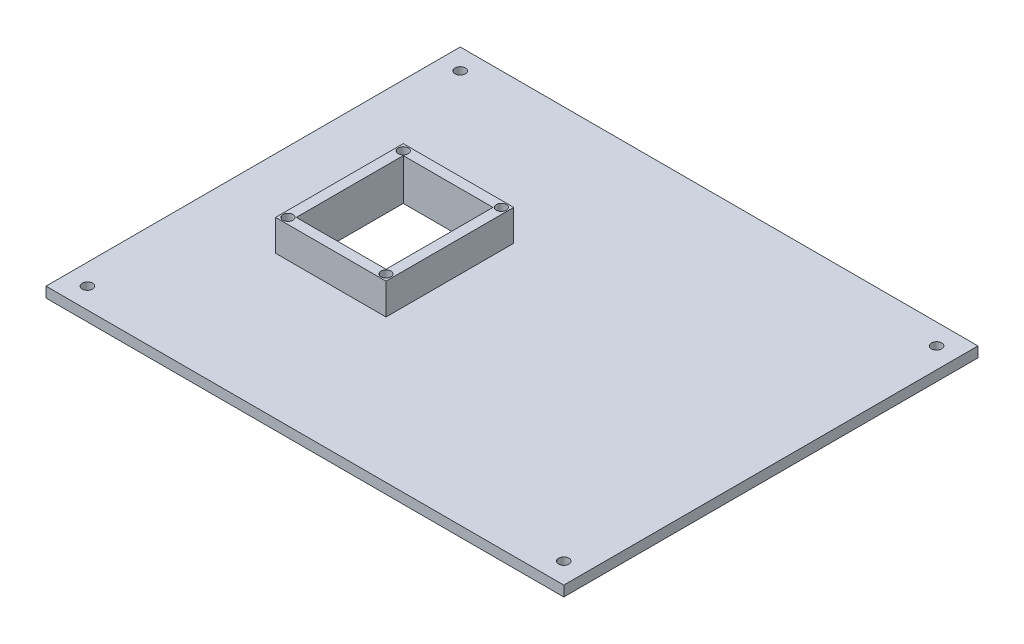
ISO-10303-21;
HEADER;
FILE_DESCRIPTION(('STEP AP214'),'2;1');
FILE_NAME('part.step','',(''),(''),'','','');
FILE_SCHEMA(('AUTOMOTIVE_DESIGN { 1 0 10303 214 1 1 1 1 }'));
ENDSEC;
DATA;
#1=APPLICATION_CONTEXT('core data for automotive mechanical design processes');
#2=APPLICATION_PROTOCOL_DEFINITION('international standard','automotive_design',2000,#1);
#3=PRODUCT_CONTEXT('',#1,'mechanical');
#4=PRODUCT('Part','Part','',(#3));
#5=PRODUCT_RELATED_PRODUCT_CATEGORY('part','',(#4));
#6=PRODUCT_DEFINITION_FORMATION('','',#4);
#7=PRODUCT_DEFINITION_CONTEXT('part definition',#1,'design');
#8=PRODUCT_DEFINITION('design','',#6,#7);
#9=PRODUCT_DEFINITION_SHAPE('','',#8);
#10=(LENGTH_UNIT() NAMED_UNIT(*) SI_UNIT(.MILLI.,.METRE.));
#11=(NAMED_UNIT(*) PLANE_ANGLE_UNIT() SI_UNIT($,.RADIAN.));
#12=(NAMED_UNIT(*) SI_UNIT($,.STERADIAN.) SOLID_ANGLE_UNIT());
#13=UNCERTAINTY_MEASURE_WITH_UNIT(LENGTH_MEASURE(1.E-05),#10,'distance_accuracy_value','');
#14=(GEOMETRIC_REPRESENTATION_CONTEXT(3) GLOBAL_UNCERTAINTY_ASSIGNED_CONTEXT((#13)) GLOBAL_UNIT_ASSIGNED_CONTEXT((#10,
#11,#12)) REPRESENTATION_CONTEXT('',''));
#15=CARTESIAN_POINT('',(0.,0.,0.));
#16=DIRECTION('',(0.,0.,1.));
#17=DIRECTION('',(1.,0.,0.));
#18=AXIS2_PLACEMENT_3D('',#15,#16,#17);
#19=CARTESIAN_POINT('',(0.,12.,0.));
#20=DIRECTION('',(0.,-1.,0.));
#21=DIRECTION('',(0.,0.,-1.));
#22=AXIS2_PLACEMENT_3D('',#19,#20,#21);
#23=PLANE('',#22);
#24=DIRECTION('',(0.,0.,-1.));
#25=VECTOR('',#24,1.);
#26=CARTESIAN_POINT('',(-93.8601114655755,12.,18.5));
#27=LINE('',#26,#25);
#28=CARTESIAN_POINT('',(-93.8601114655755,12.,18.5));
#29=VERTEX_POINT('',#28);
#30=CARTESIAN_POINT('',(-93.8601114655755,12.,-18.5));
#31=VERTEX_POINT('',#30);
#32=EDGE_CURVE('E167',#29,#31,#27,.T.);
#33=ORIENTED_EDGE('',*,*,#32,.T.);
#34=DIRECTION('',(-1.,0.,0.));
#35=VECTOR('',#34,1.);
#36=CARTESIAN_POINT('',(-125.860111465575,12.,-18.5));
#37=LINE('',#36,#35);
#38=CARTESIAN_POINT('',(-125.860111465575,12.,-18.5));
#39=VERTEX_POINT('',#38);
#40=EDGE_CURVE('E173',#31,#39,#37,.T.);
#41=ORIENTED_EDGE('',*,*,#40,.T.);
#42=DIRECTION('',(0.,0.,1.));
#43=VECTOR('',#42,1.);
#44=CARTESIAN_POINT('',(-125.860111465575,12.,18.5));
#45=LINE('',#44,#43);
#46=CARTESIAN_POINT('',(-125.860111465575,12.,18.5));
#47=VERTEX_POINT('',#46);
#48=EDGE_CURVE('E176',#39,#47,#45,.T.);
#49=ORIENTED_EDGE('',*,*,#48,.T.);
#50=DIRECTION('',(1.,0.,0.));
#51=VECTOR('',#50,1.);
#52=CARTESIAN_POINT('',(-125.860111465575,12.,18.5));
#53=LINE('',#52,#51);
#54=EDGE_CURVE('E178',#47,#29,#53,.T.);
#55=ORIENTED_EDGE('',*,*,#54,.T.);
#56=EDGE_LOOP('',(#33,#41,#49,#55));
#57=FACE_BOUND('',#56,.T.);
#58=DIRECTION('',(1.,0.,0.));
#59=VECTOR('',#58,1.);
#60=CARTESIAN_POINT('',(-122.860111465575,12.,-15.5));
#61=LINE('',#60,#59);
#62=CARTESIAN_POINT('',(-122.860111465575,12.,-15.5));
#63=VERTEX_POINT('',#62);
#64=CARTESIAN_POINT('',(-96.8601114655755,12.,-15.5));
#65=VERTEX_POINT('',#64);
#66=EDGE_CURVE('E68',#63,#65,#61,.T.);
#67=ORIENTED_EDGE('',*,*,#66,.T.);
#68=DIRECTION('',(0.,0.,-1.));
#69=VECTOR('',#68,1.);
#70=CARTESIAN_POINT('',(-96.8601114655755,12.,15.5));
#71=LINE('',#70,#69);
#72=CARTESIAN_POINT('',(-96.8601114655755,12.,15.5));
#73=VERTEX_POINT('',#72);
#74=EDGE_CURVE('E146',#73,#65,#71,.T.);
#75=ORIENTED_EDGE('',*,*,#74,.F.);
#76=DIRECTION('',(1.,0.,0.));
#77=VECTOR('',#76,1.);
#78=CARTESIAN_POINT('',(-122.860111465575,12.,15.5));
#79=LINE('',#78,#77);
#80=CARTESIAN_POINT('',(-122.860111465575,12.,15.5));
#81=VERTEX_POINT('',#80);
#82=EDGE_CURVE('E163',#81,#73,#79,.T.);
#83=ORIENTED_EDGE('',*,*,#82,.F.);
#84=DIRECTION('',(0.,0.,-1.));
#85=VECTOR('',#84,1.);
#86=CARTESIAN_POINT('',(-122.860111465575,12.,15.5));
#87=LINE('',#86,#85);
#88=EDGE_CURVE('E142',#81,#63,#87,.T.);
#89=ORIENTED_EDGE('',*,*,#88,.T.);
#90=EDGE_LOOP('',(#67,#75,#83,#89));
#91=FACE_BOUND('',#90,.T.);
#92=CARTESIAN_POINT('',(-95.6601114655755,12.000012,16.7));
#93=DIRECTION('',(0.,1.,0.));
#94=DIRECTION('',(0.,0.,1.));
#95=AXIS2_PLACEMENT_3D('',#92,#93,#94);
#96=CIRCLE('',#95,1.45);
#97=CARTESIAN_POINT('',(-95.6601114655755,12.000012,18.15));
#98=VERTEX_POINT('',#97);
#99=EDGE_CURVE('E235',#98,#98,#96,.T.);
#100=ORIENTED_EDGE('',*,*,#99,.F.);
#101=EDGE_LOOP('',(#100));
#102=FACE_BOUND('',#101,.T.);
#103=CARTESIAN_POINT('',(-95.6601114655755,12.000012,-16.7));
#104=DIRECTION('',(0.,1.,0.));
#105=DIRECTION('',(0.,0.,1.));
#106=AXIS2_PLACEMENT_3D('',#103,#104,#105);
#107=CIRCLE('',#106,1.45);
#108=CARTESIAN_POINT('',(-95.6601114655755,12.000012,-15.25));
#109=VERTEX_POINT('',#108);
#110=EDGE_CURVE('E382',#109,#109,#107,.T.);
#111=ORIENTED_EDGE('',*,*,#110,.F.);
#112=EDGE_LOOP('',(#111));
#113=FACE_BOUND('',#112,.T.);
#114=CARTESIAN_POINT('',(-124.060111465575,12.000012,-16.7));
#115=DIRECTION('',(0.,1.,0.));
#116=DIRECTION('',(0.,0.,1.));
#117=AXIS2_PLACEMENT_3D('',#114,#115,#116);
#118=CIRCLE('',#117,1.45);
#119=CARTESIAN_POINT('',(-124.060111465575,12.000012,-15.25));
#120=VERTEX_POINT('',#119);
#121=EDGE_CURVE('E267',#120,#120,#118,.T.);
#122=ORIENTED_EDGE('',*,*,#121,.F.);
#123=EDGE_LOOP('',(#122));
#124=FACE_BOUND('',#123,.T.);
#125=CARTESIAN_POINT('',(-124.060111465575,12.000012,16.7));
#126=DIRECTION('',(0.,1.,0.));
#127=DIRECTION('',(0.,0.,1.));
#128=AXIS2_PLACEMENT_3D('',#125,#126,#127);
#129=CIRCLE('',#128,1.45);
#130=CARTESIAN_POINT('',(-124.060111465575,12.000012,18.15));
#131=VERTEX_POINT('',#130);
#132=EDGE_CURVE('E276',#131,#131,#129,.T.);
#133=ORIENTED_EDGE('',*,*,#132,.F.);
#134=EDGE_LOOP('',(#133));
#135=FACE_BOUND('',#134,.T.);
#136=ADVANCED_FACE('F39',(#57,#91,#102,#113,#124,#135),#23,.F.);
#137=CARTESIAN_POINT('',(-150.860111465575,0.,60.));
#138=DIRECTION('',(0.,1.,0.));
#139=DIRECTION('',(0.,0.,1.));
#140=AXIS2_PLACEMENT_3D('',#137,#138,#139);
#141=PLANE('',#140);
#142=CARTESIAN_POINT('',(-144.860111465575,0.,54.));
#143=DIRECTION('',(0.,1.,0.));
#144=DIRECTION('',(0.,0.,1.));
#145=AXIS2_PLACEMENT_3D('',#142,#143,#144);
#146=CIRCLE('',#145,1.5);
#147=CARTESIAN_POINT('',(-144.860111465575,0.,55.5));
#148=VERTEX_POINT('',#147);
#149=EDGE_CURVE('E281',#148,#148,#146,.T.);
#150=ORIENTED_EDGE('',*,*,#149,.T.);
#151=EDGE_LOOP('',(#150));
#152=FACE_BOUND('',#151,.T.);
#153=CARTESIAN_POINT('',(-6.8601114655755,0.,-54.));
#154=DIRECTION('',(0.,1.,0.));
#155=DIRECTION('',(0.,0.,1.));
#156=AXIS2_PLACEMENT_3D('',#153,#154,#155);
#157=CIRCLE('',#156,1.5);
#158=CARTESIAN_POINT('',(-6.8601114655755,0.,-52.5));
#159=VERTEX_POINT('',#158);
#160=EDGE_CURVE('E286',#159,#159,#157,.T.);
#161=ORIENTED_EDGE('',*,*,#160,.T.);
#162=EDGE_LOOP('',(#161));
#163=FACE_BOUND('',#162,.T.);
#164=CARTESIAN_POINT('',(-6.8601114655755,0.,54.));
#165=DIRECTION('',(0.,1.,0.));
#166=DIRECTION('',(0.,0.,1.));
#167=AXIS2_PLACEMENT_3D('',#164,#165,#166);
#168=CIRCLE('',#167,1.5);
#169=CARTESIAN_POINT('',(-6.8601114655755,0.,55.5));
#170=VERTEX_POINT('',#169);
#171=EDGE_CURVE('E367',#170,#170,#168,.T.);
#172=ORIENTED_EDGE('',*,*,#171,.T.);
#173=EDGE_LOOP('',(#172));
#174=FACE_BOUND('',#173,.T.);
#175=CARTESIAN_POINT('',(-144.860111465575,0.,-54.));
#176=DIRECTION('',(0.,1.,0.));
#177=DIRECTION('',(0.,0.,1.));
#178=AXIS2_PLACEMENT_3D('',#175,#176,#177);
#179=CIRCLE('',#178,1.5);
#180=CARTESIAN_POINT('',(-144.860111465575,0.,-52.5));
#181=VERTEX_POINT('',#180);
#182=EDGE_CURVE('E371',#181,#181,#179,.T.);
#183=ORIENTED_EDGE('',*,*,#182,.T.);
#184=EDGE_LOOP('',(#183));
#185=FACE_BOUND('',#184,.T.);
#186=CARTESIAN_POINT('',(-124.060111465575,0.,16.7));
#187=DIRECTION('',(0.,1.,0.));
#188=DIRECTION('',(0.,0.,1.));
#189=AXIS2_PLACEMENT_3D('',#186,#187,#188);
#190=CIRCLE('',#189,1.45);
#191=CARTESIAN_POINT('',(-124.060111465575,0.,18.15));
#192=VERTEX_POINT('',#191);
#193=EDGE_CURVE('E283',#192,#192,#190,.T.);
#194=ORIENTED_EDGE('',*,*,#193,.T.);
#195=EDGE_LOOP('',(#194));
#196=FACE_BOUND('',#195,.T.);
#197=CARTESIAN_POINT('',(-124.060111465575,0.,-16.7));
#198=DIRECTION('',(0.,1.,0.));
#199=DIRECTION('',(0.,0.,1.));
#200=AXIS2_PLACEMENT_3D('',#197,#198,#199);
#201=CIRCLE('',#200,1.45);
#202=CARTESIAN_POINT('',(-124.060111465575,0.,-15.25));
#203=VERTEX_POINT('',#202);
#204=EDGE_CURVE('E277',#203,#203,#201,.T.);
#205=ORIENTED_EDGE('',*,*,#204,.T.);
#206=EDGE_LOOP('',(#205));
#207=FACE_BOUND('',#206,.T.);
#208=CARTESIAN_POINT('',(-95.6601114655755,0.,-16.7));
#209=DIRECTION('',(0.,1.,0.));
#210=DIRECTION('',(0.,0.,1.));
#211=AXIS2_PLACEMENT_3D('',#208,#209,#210);
#212=CIRCLE('',#211,1.45);
#213=CARTESIAN_POINT('',(-95.6601114655755,0.,-15.25));
#214=VERTEX_POINT('',#213);
#215=EDGE_CURVE('E378',#214,#214,#212,.T.);
#216=ORIENTED_EDGE('',*,*,#215,.T.);
#217=EDGE_LOOP('',(#216));
#218=FACE_BOUND('',#217,.T.);
#219=CARTESIAN_POINT('',(-95.6601114655755,0.,16.7));
#220=DIRECTION('',(0.,1.,0.));
#221=DIRECTION('',(0.,0.,1.));
#222=AXIS2_PLACEMENT_3D('',#219,#220,#221);
#223=CIRCLE('',#222,1.45);
#224=CARTESIAN_POINT('',(-95.6601114655755,0.,18.15));
#225=VERTEX_POINT('',#224);
#226=EDGE_CURVE('E159',#225,#225,#223,.T.);
#227=ORIENTED_EDGE('',*,*,#226,.T.);
#228=EDGE_LOOP('',(#227));
#229=FACE_BOUND('',#228,.T.);
#230=DIRECTION('',(1.,0.,0.));
#231=VECTOR('',#230,1.);
#232=CARTESIAN_POINT('',(-150.860111465575,0.,-60.));
#233=LINE('',#232,#231);
#234=CARTESIAN_POINT('',(-150.860111465575,0.,-60.));
#235=VERTEX_POINT('',#234);
#236=CARTESIAN_POINT('',(-0.860111465575492,0.,-60.));
#237=VERTEX_POINT('',#236);
#238=EDGE_CURVE('E219',#235,#237,#233,.T.);
#239=ORIENTED_EDGE('',*,*,#238,.T.);
#240=DIRECTION('',(0.,0.,-1.));
#241=VECTOR('',#240,1.);
#242=CARTESIAN_POINT('',(-0.860111465575492,0.,60.));
#243=LINE('',#242,#241);
#244=CARTESIAN_POINT('',(-0.860111465575492,0.,60.));
#245=VERTEX_POINT('',#244);
#246=EDGE_CURVE('E212',#245,#237,#243,.T.);
#247=ORIENTED_EDGE('',*,*,#246,.F.);
#248=DIRECTION('',(1.,0.,0.));
#249=VECTOR('',#248,1.);
#250=CARTESIAN_POINT('',(-150.860111465575,0.,60.));
#251=LINE('',#250,#249);
#252=CARTESIAN_POINT('',(-150.860111465575,0.,60.));
#253=VERTEX_POINT('',#252);
#254=EDGE_CURVE('E209',#253,#245,#251,.T.);
#255=ORIENTED_EDGE('',*,*,#254,.F.);
#256=DIRECTION('',(0.,0.,-1.));
#257=VECTOR('',#256,1.);
#258=CARTESIAN_POINT('',(-150.860111465575,0.,60.));
#259=LINE('',#258,#257);
#260=EDGE_CURVE('E223',#253,#235,#259,.T.);
#261=ORIENTED_EDGE('',*,*,#260,.T.);
#262=EDGE_LOOP('',(#239,#247,#255,#261));
#263=FACE_BOUND('',#262,.T.);
#264=DIRECTION('',(1.,0.,0.));
#265=VECTOR('',#264,1.);
#266=CARTESIAN_POINT('',(-122.860111465575,0.,-15.5));
#267=LINE('',#266,#265);
#268=CARTESIAN_POINT('',(-122.860111465575,0.,-15.5));
#269=VERTEX_POINT('',#268);
#270=CARTESIAN_POINT('',(-96.8601114655755,0.,-15.5));
#271=VERTEX_POINT('',#270);
#272=EDGE_CURVE('E133',#269,#271,#267,.T.);
#273=ORIENTED_EDGE('',*,*,#272,.F.);
#274=DIRECTION('',(0.,0.,-1.));
#275=VECTOR('',#274,1.);
#276=CARTESIAN_POINT('',(-122.860111465575,0.,15.5));
#277=LINE('',#276,#275);
#278=CARTESIAN_POINT('',(-122.860111465575,0.,15.5));
#279=VERTEX_POINT('',#278);
#280=EDGE_CURVE('E152',#279,#269,#277,.T.);
#281=ORIENTED_EDGE('',*,*,#280,.F.);
#282=DIRECTION('',(1.,0.,0.));
#283=VECTOR('',#282,1.);
#284=CARTESIAN_POINT('',(-122.860111465575,0.,15.5));
#285=LINE('',#284,#283);
#286=CARTESIAN_POINT('',(-96.8601114655755,0.,15.5));
#287=VERTEX_POINT('',#286);
#288=EDGE_CURVE('E59',#279,#287,#285,.T.);
#289=ORIENTED_EDGE('',*,*,#288,.T.);
#290=DIRECTION('',(0.,0.,-1.));
#291=VECTOR('',#290,1.);
#292=CARTESIAN_POINT('',(-96.8601114655755,0.,15.5));
#293=LINE('',#292,#291);
#294=EDGE_CURVE('E136',#287,#271,#293,.T.);
#295=ORIENTED_EDGE('',*,*,#294,.T.);
#296=EDGE_LOOP('',(#273,#281,#289,#295));
#297=FACE_BOUND('',#296,.T.);
#298=ADVANCED_FACE('F153',(#152,#163,#174,#185,#196,#207,#218,#229,#263,#297),#141,.F.);
#299=CARTESIAN_POINT('',(-55.3430096136407,3.,-60.));
#300=DIRECTION('',(0.,-1.,0.));
#301=DIRECTION('',(0.,0.,-1.));
#302=AXIS2_PLACEMENT_3D('',#299,#300,#301);
#303=PLANE('',#302);
#304=CARTESIAN_POINT('',(-144.860111465575,3.,54.));
#305=DIRECTION('',(0.,1.,0.));
#306=DIRECTION('',(0.,0.,1.));
#307=AXIS2_PLACEMENT_3D('',#304,#305,#306);
#308=CIRCLE('',#307,1.5);
#309=CARTESIAN_POINT('',(-144.860111465575,3.,55.5));
#310=VERTEX_POINT('',#309);
#311=EDGE_CURVE('E445',#310,#310,#308,.T.);
#312=ORIENTED_EDGE('',*,*,#311,.F.);
#313=EDGE_LOOP('',(#312));
#314=FACE_BOUND('',#313,.T.);
#315=CARTESIAN_POINT('',(-6.8601114655755,3.,-54.));
#316=DIRECTION('',(0.,1.,0.));
#317=DIRECTION('',(0.,0.,1.));
#318=AXIS2_PLACEMENT_3D('',#315,#316,#317);
#319=CIRCLE('',#318,1.5);
#320=CARTESIAN_POINT('',(-6.8601114655755,3.,-52.5));
#321=VERTEX_POINT('',#320);
#322=EDGE_CURVE('E447',#321,#321,#319,.T.);
#323=ORIENTED_EDGE('',*,*,#322,.F.);
#324=EDGE_LOOP('',(#323));
#325=FACE_BOUND('',#324,.T.);
#326=CARTESIAN_POINT('',(-6.8601114655755,3.,54.));
#327=DIRECTION('',(0.,1.,0.));
#328=DIRECTION('',(0.,0.,1.));
#329=AXIS2_PLACEMENT_3D('',#326,#327,#328);
#330=CIRCLE('',#329,1.5);
#331=CARTESIAN_POINT('',(-6.8601114655755,3.,55.5));
#332=VERTEX_POINT('',#331);
#333=EDGE_CURVE('E366',#332,#332,#330,.T.);
#334=ORIENTED_EDGE('',*,*,#333,.F.);
#335=EDGE_LOOP('',(#334));
#336=FACE_BOUND('',#335,.T.);
#337=CARTESIAN_POINT('',(-144.860111465575,3.,-54.));
#338=DIRECTION('',(0.,1.,0.));
#339=DIRECTION('',(0.,0.,1.));
#340=AXIS2_PLACEMENT_3D('',#337,#338,#339);
#341=CIRCLE('',#340,1.5);
#342=CARTESIAN_POINT('',(-144.860111465575,3.,-52.5));
#343=VERTEX_POINT('',#342);
#344=EDGE_CURVE('E376',#343,#343,#341,.T.);
#345=ORIENTED_EDGE('',*,*,#344,.F.);
#346=EDGE_LOOP('',(#345));
#347=FACE_BOUND('',#346,.T.);
#348=DIRECTION('',(1.,0.,0.));
#349=VECTOR('',#348,1.);
#350=CARTESIAN_POINT('',(-55.3430096136407,3.,60.));
#351=LINE('',#350,#349);
#352=CARTESIAN_POINT('',(-150.860111465575,3.,60.));
#353=VERTEX_POINT('',#352);
#354=CARTESIAN_POINT('',(-0.860111465575492,3.,60.));
#355=VERTEX_POINT('',#354);
#356=EDGE_CURVE('E205',#353,#355,#351,.T.);
#357=ORIENTED_EDGE('',*,*,#356,.T.);
#358=DIRECTION('',(0.,0.,1.));
#359=VECTOR('',#358,1.);
#360=CARTESIAN_POINT('',(-0.860111465575492,3.,60.));
#361=LINE('',#360,#359);
#362=CARTESIAN_POINT('',(-0.860111465575492,3.,-60.));
#363=VERTEX_POINT('',#362);
#364=EDGE_CURVE('E11',#363,#355,#361,.T.);
#365=ORIENTED_EDGE('',*,*,#364,.F.);
#366=DIRECTION('',(1.,0.,0.));
#367=VECTOR('',#366,1.);
#368=CARTESIAN_POINT('',(-55.3430096136407,3.,-60.));
#369=LINE('',#368,#367);
#370=CARTESIAN_POINT('',(-150.860111465575,3.,-60.));
#371=VERTEX_POINT('',#370);
#372=EDGE_CURVE('E203',#371,#363,#369,.T.);
#373=ORIENTED_EDGE('',*,*,#372,.F.);
#374=DIRECTION('',(0.,0.,-1.));
#375=VECTOR('',#374,1.);
#376=CARTESIAN_POINT('',(-150.860111465575,3.,60.));
#377=LINE('',#376,#375);
#378=EDGE_CURVE('E49',#353,#371,#377,.T.);
#379=ORIENTED_EDGE('',*,*,#378,.F.);
#380=EDGE_LOOP('',(#357,#365,#373,#379));
#381=FACE_BOUND('',#380,.T.);
#382=DIRECTION('',(0.,0.,-1.));
#383=VECTOR('',#382,1.);
#384=CARTESIAN_POINT('',(-93.8601114655755,3.,18.5));
#385=LINE('',#384,#383);
#386=CARTESIAN_POINT('',(-93.8601114655755,3.,18.5));
#387=VERTEX_POINT('',#386);
#388=CARTESIAN_POINT('',(-93.8601114655755,3.,-18.5));
#389=VERTEX_POINT('',#388);
#390=EDGE_CURVE('E150',#387,#389,#385,.T.);
#391=ORIENTED_EDGE('',*,*,#390,.F.);
#392=DIRECTION('',(1.,0.,0.));
#393=VECTOR('',#392,1.);
#394=CARTESIAN_POINT('',(-125.860111465575,3.,18.5));
#395=LINE('',#394,#393);
#396=CARTESIAN_POINT('',(-125.860111465575,3.,18.5));
#397=VERTEX_POINT('',#396);
#398=EDGE_CURVE('E172',#397,#387,#395,.T.);
#399=ORIENTED_EDGE('',*,*,#398,.F.);
#400=DIRECTION('',(0.,0.,1.));
#401=VECTOR('',#400,1.);
#402=CARTESIAN_POINT('',(-125.860111465575,3.,18.5));
#403=LINE('',#402,#401);
#404=CARTESIAN_POINT('',(-125.860111465575,3.,-18.5));
#405=VERTEX_POINT('',#404);
#406=EDGE_CURVE('E187',#405,#397,#403,.T.);
#407=ORIENTED_EDGE('',*,*,#406,.F.);
#408=DIRECTION('',(-1.,0.,0.));
#409=VECTOR('',#408,1.);
#410=CARTESIAN_POINT('',(-125.860111465575,3.,-18.5));
#411=LINE('',#410,#409);
#412=EDGE_CURVE('E182',#389,#405,#411,.T.);
#413=ORIENTED_EDGE('',*,*,#412,.F.);
#414=EDGE_LOOP('',(#391,#399,#407,#413));
#415=FACE_BOUND('',#414,.T.);
#416=ADVANCED_FACE('F394',(#314,#325,#336,#347,#381,#415),#303,.F.);
#417=CARTESIAN_POINT('',(-0.860111465575492,0.,60.));
#418=DIRECTION('',(-1.,0.,0.));
#419=DIRECTION('',(0.,0.,1.));
#420=AXIS2_PLACEMENT_3D('',#417,#418,#419);
#421=PLANE('',#420);
#422=DIRECTION('',(0.,1.,0.));
#423=VECTOR('',#422,1.);
#424=CARTESIAN_POINT('',(-0.860111465575492,0.,-60.));
#425=LINE('',#424,#423);
#426=EDGE_CURVE('E208',#237,#363,#425,.T.);
#427=ORIENTED_EDGE('',*,*,#426,.T.);
#428=ORIENTED_EDGE('',*,*,#364,.T.);
#429=DIRECTION('',(0.,1.,0.));
#430=VECTOR('',#429,1.);
#431=CARTESIAN_POINT('',(-0.860111465575492,0.,60.));
#432=LINE('',#431,#430);
#433=EDGE_CURVE('E211',#245,#355,#432,.T.);
#434=ORIENTED_EDGE('',*,*,#433,.F.);
#435=ORIENTED_EDGE('',*,*,#246,.T.);
#436=EDGE_LOOP('',(#427,#428,#434,#435));
#437=FACE_BOUND('',#436,.T.);
#438=ADVANCED_FACE('F409',(#437),#421,.F.);
#439=CARTESIAN_POINT('',(0.,0.,-60.));
#440=DIRECTION('',(0.,0.,1.));
#441=DIRECTION('',(1.,0.,0.));
#442=AXIS2_PLACEMENT_3D('',#439,#440,#441);
#443=PLANE('',#442);
#444=DIRECTION('',(0.,-1.,0.));
#445=VECTOR('',#444,1.);
#446=CARTESIAN_POINT('',(-150.860111465575,18.0000000000001,-60.));
#447=LINE('',#446,#445);
#448=EDGE_CURVE('E201',#371,#235,#447,.T.);
#449=ORIENTED_EDGE('',*,*,#448,.F.);
#450=ORIENTED_EDGE('',*,*,#372,.T.);
#451=ORIENTED_EDGE('',*,*,#426,.F.);
#452=ORIENTED_EDGE('',*,*,#238,.F.);
#453=EDGE_LOOP('',(#449,#450,#451,#452));
#454=FACE_BOUND('',#453,.T.);
#455=ADVANCED_FACE('F406',(#454),#443,.F.);
#456=CARTESIAN_POINT('',(0.,0.,60.));
#457=DIRECTION('',(0.,0.,1.));
#458=DIRECTION('',(1.,0.,0.));
#459=AXIS2_PLACEMENT_3D('',#456,#457,#458);
#460=PLANE('',#459);
#461=ORIENTED_EDGE('',*,*,#356,.F.);
#462=DIRECTION('',(0.,-1.,0.));
#463=VECTOR('',#462,1.);
#464=CARTESIAN_POINT('',(-150.860111465575,18.0000000000001,60.));
#465=LINE('',#464,#463);
#466=EDGE_CURVE('E210',#353,#253,#465,.T.);
#467=ORIENTED_EDGE('',*,*,#466,.T.);
#468=ORIENTED_EDGE('',*,*,#254,.T.);
#469=ORIENTED_EDGE('',*,*,#433,.T.);
#470=EDGE_LOOP('',(#461,#467,#468,#469));
#471=FACE_BOUND('',#470,.T.);
#472=ADVANCED_FACE('F412',(#471),#460,.T.);
#473=CARTESIAN_POINT('',(-150.860111465575,18.0000000000001,60.));
#474=DIRECTION('',(1.,0.,0.));
#475=DIRECTION('',(0.,0.,-1.));
#476=AXIS2_PLACEMENT_3D('',#473,#474,#475);
#477=PLANE('',#476);
#478=ORIENTED_EDGE('',*,*,#466,.F.);
#479=ORIENTED_EDGE('',*,*,#378,.T.);
#480=ORIENTED_EDGE('',*,*,#448,.T.);
#481=ORIENTED_EDGE('',*,*,#260,.F.);
#482=EDGE_LOOP('',(#478,#479,#480,#481));
#483=FACE_BOUND('',#482,.T.);
#484=ADVANCED_FACE('F41',(#483),#477,.F.);
#485=CARTESIAN_POINT('',(-93.8601114655755,12.,18.5));
#486=DIRECTION('',(-1.,0.,0.));
#487=DIRECTION('',(0.,0.,1.));
#488=AXIS2_PLACEMENT_3D('',#485,#486,#487);
#489=PLANE('',#488);
#490=ORIENTED_EDGE('',*,*,#390,.T.);
#491=DIRECTION('',(0.,-1.,0.));
#492=VECTOR('',#491,1.);
#493=CARTESIAN_POINT('',(-93.8601114655755,12.,-18.5));
#494=LINE('',#493,#492);
#495=EDGE_CURVE('E200',#31,#389,#494,.T.);
#496=ORIENTED_EDGE('',*,*,#495,.F.);
#497=ORIENTED_EDGE('',*,*,#32,.F.);
#498=DIRECTION('',(0.,-1.,0.));
#499=VECTOR('',#498,1.);
#500=CARTESIAN_POINT('',(-93.8601114655755,12.,18.5));
#501=LINE('',#500,#499);
#502=EDGE_CURVE('E179',#29,#387,#501,.T.);
#503=ORIENTED_EDGE('',*,*,#502,.T.);
#504=EDGE_LOOP('',(#490,#496,#497,#503));
#505=FACE_BOUND('',#504,.T.);
#506=ADVANCED_FACE('F420',(#505),#489,.F.);
#507=CARTESIAN_POINT('',(-125.860111465575,12.,-18.5));
#508=DIRECTION('',(0.,0.,1.));
#509=DIRECTION('',(1.,0.,0.));
#510=AXIS2_PLACEMENT_3D('',#507,#508,#509);
#511=PLANE('',#510);
#512=ORIENTED_EDGE('',*,*,#412,.T.);
#513=DIRECTION('',(0.,-1.,0.));
#514=VECTOR('',#513,1.);
#515=CARTESIAN_POINT('',(-125.860111465575,12.,-18.5));
#516=LINE('',#515,#514);
#517=EDGE_CURVE('E198',#39,#405,#516,.T.);
#518=ORIENTED_EDGE('',*,*,#517,.F.);
#519=ORIENTED_EDGE('',*,*,#40,.F.);
#520=ORIENTED_EDGE('',*,*,#495,.T.);
#521=EDGE_LOOP('',(#512,#518,#519,#520));
#522=FACE_BOUND('',#521,.T.);
#523=ADVANCED_FACE('F422',(#522),#511,.F.);
#524=CARTESIAN_POINT('',(-125.860111465575,12.,18.5));
#525=DIRECTION('',(1.,0.,0.));
#526=DIRECTION('',(0.,0.,-1.));
#527=AXIS2_PLACEMENT_3D('',#524,#525,#526);
#528=PLANE('',#527);
#529=ORIENTED_EDGE('',*,*,#406,.T.);
#530=DIRECTION('',(0.,-1.,0.));
#531=VECTOR('',#530,1.);
#532=CARTESIAN_POINT('',(-125.860111465575,12.,18.5));
#533=LINE('',#532,#531);
#534=EDGE_CURVE('E195',#47,#397,#533,.T.);
#535=ORIENTED_EDGE('',*,*,#534,.F.);
#536=ORIENTED_EDGE('',*,*,#48,.F.);
#537=ORIENTED_EDGE('',*,*,#517,.T.);
#538=EDGE_LOOP('',(#529,#535,#536,#537));
#539=FACE_BOUND('',#538,.T.);
#540=ADVANCED_FACE('F558',(#539),#528,.F.);
#541=CARTESIAN_POINT('',(-125.860111465575,12.,18.5));
#542=DIRECTION('',(0.,0.,-1.));
#543=DIRECTION('',(-1.,0.,0.));
#544=AXIS2_PLACEMENT_3D('',#541,#542,#543);
#545=PLANE('',#544);
#546=ORIENTED_EDGE('',*,*,#398,.T.);
#547=ORIENTED_EDGE('',*,*,#502,.F.);
#548=ORIENTED_EDGE('',*,*,#54,.F.);
#549=ORIENTED_EDGE('',*,*,#534,.T.);
#550=EDGE_LOOP('',(#546,#547,#548,#549));
#551=FACE_BOUND('',#550,.T.);
#552=ADVANCED_FACE('F248',(#551),#545,.F.);
#553=CARTESIAN_POINT('',(-122.860111465575,0.,-15.5));
#554=DIRECTION('',(0.,0.,1.));
#555=DIRECTION('',(1.,0.,0.));
#556=AXIS2_PLACEMENT_3D('',#553,#554,#555);
#557=PLANE('',#556);
#558=ORIENTED_EDGE('',*,*,#66,.F.);
#559=DIRECTION('',(0.,1.,0.));
#560=VECTOR('',#559,1.);
#561=CARTESIAN_POINT('',(-122.860111465575,0.,-15.5));
#562=LINE('',#561,#560);
#563=EDGE_CURVE('E137',#269,#63,#562,.T.);
#564=ORIENTED_EDGE('',*,*,#563,.F.);
#565=ORIENTED_EDGE('',*,*,#272,.T.);
#566=DIRECTION('',(0.,1.,0.));
#567=VECTOR('',#566,1.);
#568=CARTESIAN_POINT('',(-96.8601114655755,0.,-15.5));
#569=LINE('',#568,#567);
#570=EDGE_CURVE('E135',#271,#65,#569,.T.);
#571=ORIENTED_EDGE('',*,*,#570,.T.);
#572=EDGE_LOOP('',(#558,#564,#565,#571));
#573=FACE_BOUND('',#572,.T.);
#574=ADVANCED_FACE('F132',(#573),#557,.T.);
#575=CARTESIAN_POINT('',(-96.8601114655755,0.,15.5));
#576=DIRECTION('',(1.,0.,0.));
#577=DIRECTION('',(0.,0.,-1.));
#578=AXIS2_PLACEMENT_3D('',#575,#576,#577);
#579=PLANE('',#578);
#580=ORIENTED_EDGE('',*,*,#74,.T.);
#581=ORIENTED_EDGE('',*,*,#570,.F.);
#582=ORIENTED_EDGE('',*,*,#294,.F.);
#583=DIRECTION('',(0.,1.,0.));
#584=VECTOR('',#583,1.);
#585=CARTESIAN_POINT('',(-96.8601114655755,0.,15.5));
#586=LINE('',#585,#584);
#587=EDGE_CURVE('E148',#287,#73,#586,.T.);
#588=ORIENTED_EDGE('',*,*,#587,.T.);
#589=EDGE_LOOP('',(#580,#581,#582,#588));
#590=FACE_BOUND('',#589,.T.);
#591=ADVANCED_FACE('F143',(#590),#579,.F.);
#592=CARTESIAN_POINT('',(-122.860111465575,0.,15.5));
#593=DIRECTION('',(0.,0.,1.));
#594=DIRECTION('',(1.,0.,0.));
#595=AXIS2_PLACEMENT_3D('',#592,#593,#594);
#596=PLANE('',#595);
#597=ORIENTED_EDGE('',*,*,#82,.T.);
#598=ORIENTED_EDGE('',*,*,#587,.F.);
#599=ORIENTED_EDGE('',*,*,#288,.F.);
#600=DIRECTION('',(0.,1.,0.));
#601=VECTOR('',#600,1.);
#602=CARTESIAN_POINT('',(-122.860111465575,0.,15.5));
#603=LINE('',#602,#601);
#604=EDGE_CURVE('E170',#279,#81,#603,.T.);
#605=ORIENTED_EDGE('',*,*,#604,.T.);
#606=EDGE_LOOP('',(#597,#598,#599,#605));
#607=FACE_BOUND('',#606,.T.);
#608=ADVANCED_FACE('F524',(#607),#596,.F.);
#609=CARTESIAN_POINT('',(-122.860111465575,0.,15.5));
#610=DIRECTION('',(1.,0.,0.));
#611=DIRECTION('',(0.,0.,-1.));
#612=AXIS2_PLACEMENT_3D('',#609,#610,#611);
#613=PLANE('',#612);
#614=ORIENTED_EDGE('',*,*,#88,.F.);
#615=ORIENTED_EDGE('',*,*,#604,.F.);
#616=ORIENTED_EDGE('',*,*,#280,.T.);
#617=ORIENTED_EDGE('',*,*,#563,.T.);
#618=EDGE_LOOP('',(#614,#615,#616,#617));
#619=FACE_BOUND('',#618,.T.);
#620=ADVANCED_FACE('F324',(#619),#613,.T.);
#621=CARTESIAN_POINT('',(-95.6601114655755,0.,16.7));
#622=DIRECTION('',(0.,1.,0.));
#623=DIRECTION('',(0.,0.,1.));
#624=AXIS2_PLACEMENT_3D('',#621,#622,#623);
#625=CYLINDRICAL_SURFACE('',#624,1.45);
#626=ORIENTED_EDGE('',*,*,#226,.F.);
#627=EDGE_LOOP('',(#626));
#628=FACE_BOUND('',#627,.T.);
#629=ORIENTED_EDGE('',*,*,#99,.T.);
#630=EDGE_LOOP('',(#629));
#631=FACE_BOUND('',#630,.T.);
#632=ADVANCED_FACE('F317',(#628,#631),#625,.F.);
#633=CARTESIAN_POINT('',(-95.6601114655755,0.,-16.7));
#634=DIRECTION('',(0.,1.,0.));
#635=DIRECTION('',(0.,0.,1.));
#636=AXIS2_PLACEMENT_3D('',#633,#634,#635);
#637=CYLINDRICAL_SURFACE('',#636,1.45);
#638=ORIENTED_EDGE('',*,*,#215,.F.);
#639=EDGE_LOOP('',(#638));
#640=FACE_BOUND('',#639,.T.);
#641=ORIENTED_EDGE('',*,*,#110,.T.);
#642=EDGE_LOOP('',(#641));
#643=FACE_BOUND('',#642,.T.);
#644=ADVANCED_FACE('F318',(#640,#643),#637,.F.);
#645=CARTESIAN_POINT('',(-124.060111465575,0.,-16.7));
#646=DIRECTION('',(0.,1.,0.));
#647=DIRECTION('',(0.,0.,1.));
#648=AXIS2_PLACEMENT_3D('',#645,#646,#647);
#649=CYLINDRICAL_SURFACE('',#648,1.45);
#650=ORIENTED_EDGE('',*,*,#204,.F.);
#651=EDGE_LOOP('',(#650));
#652=FACE_BOUND('',#651,.T.);
#653=ORIENTED_EDGE('',*,*,#121,.T.);
#654=EDGE_LOOP('',(#653));
#655=FACE_BOUND('',#654,.T.);
#656=ADVANCED_FACE('F315',(#652,#655),#649,.F.);
#657=CARTESIAN_POINT('',(-124.060111465575,0.,16.7));
#658=DIRECTION('',(0.,1.,0.));
#659=DIRECTION('',(0.,0.,1.));
#660=AXIS2_PLACEMENT_3D('',#657,#658,#659);
#661=CYLINDRICAL_SURFACE('',#660,1.45);
#662=ORIENTED_EDGE('',*,*,#193,.F.);
#663=EDGE_LOOP('',(#662));
#664=FACE_BOUND('',#663,.T.);
#665=ORIENTED_EDGE('',*,*,#132,.T.);
#666=EDGE_LOOP('',(#665));
#667=FACE_BOUND('',#666,.T.);
#668=ADVANCED_FACE('F301',(#664,#667),#661,.F.);
#669=CARTESIAN_POINT('',(-144.860111465575,-7.,-54.));
#670=DIRECTION('',(0.,1.,0.));
#671=DIRECTION('',(0.,0.,1.));
#672=AXIS2_PLACEMENT_3D('',#669,#670,#671);
#673=CYLINDRICAL_SURFACE('',#672,1.5);
#674=ORIENTED_EDGE('',*,*,#344,.T.);
#675=EDGE_LOOP('',(#674));
#676=FACE_BOUND('',#675,.T.);
#677=ORIENTED_EDGE('',*,*,#182,.F.);
#678=EDGE_LOOP('',(#677));
#679=FACE_BOUND('',#678,.T.);
#680=ADVANCED_FACE('F311',(#676,#679),#673,.F.);
#681=CARTESIAN_POINT('',(-6.8601114655755,-7.,54.));
#682=DIRECTION('',(0.,1.,0.));
#683=DIRECTION('',(0.,0.,1.));
#684=AXIS2_PLACEMENT_3D('',#681,#682,#683);
#685=CYLINDRICAL_SURFACE('',#684,1.5);
#686=ORIENTED_EDGE('',*,*,#333,.T.);
#687=EDGE_LOOP('',(#686));
#688=FACE_BOUND('',#687,.T.);
#689=ORIENTED_EDGE('',*,*,#171,.F.);
#690=EDGE_LOOP('',(#689));
#691=FACE_BOUND('',#690,.T.);
#692=ADVANCED_FACE('F350',(#688,#691),#685,.F.);
#693=CARTESIAN_POINT('',(-6.8601114655755,-7.,-54.));
#694=DIRECTION('',(0.,1.,0.));
#695=DIRECTION('',(0.,0.,1.));
#696=AXIS2_PLACEMENT_3D('',#693,#694,#695);
#697=CYLINDRICAL_SURFACE('',#696,1.5);
#698=ORIENTED_EDGE('',*,*,#322,.T.);
#699=EDGE_LOOP('',(#698));
#700=FACE_BOUND('',#699,.T.);
#701=ORIENTED_EDGE('',*,*,#160,.F.);
#702=EDGE_LOOP('',(#701));
#703=FACE_BOUND('',#702,.T.);
#704=ADVANCED_FACE('F352',(#700,#703),#697,.F.);
#705=CARTESIAN_POINT('',(-144.860111465575,-7.,54.));
#706=DIRECTION('',(0.,1.,0.));
#707=DIRECTION('',(0.,0.,1.));
#708=AXIS2_PLACEMENT_3D('',#705,#706,#707);
#709=CYLINDRICAL_SURFACE('',#708,1.5);
#710=ORIENTED_EDGE('',*,*,#311,.T.);
#711=EDGE_LOOP('',(#710));
#712=FACE_BOUND('',#711,.T.);
#713=ORIENTED_EDGE('',*,*,#149,.F.);
#714=EDGE_LOOP('',(#713));
#715=FACE_BOUND('',#714,.T.);
#716=ADVANCED_FACE('F354',(#712,#715),#709,.F.);
#717=CLOSED_SHELL('',(#136,#298,#416,#438,#455,#472,#484,#506,#523,#540,#552,#574,#591,#608,
#620,#632,#644,#656,#668,#680,#692,#704,#716));
#718=MANIFOLD_SOLID_BREP('B2',#717);
#719=ADVANCED_BREP_SHAPE_REPRESENTATION('',(#18,#718),#14);
#720=SHAPE_DEFINITION_REPRESENTATION(#9,#719);
ENDSEC;
END-ISO-10303-21;
